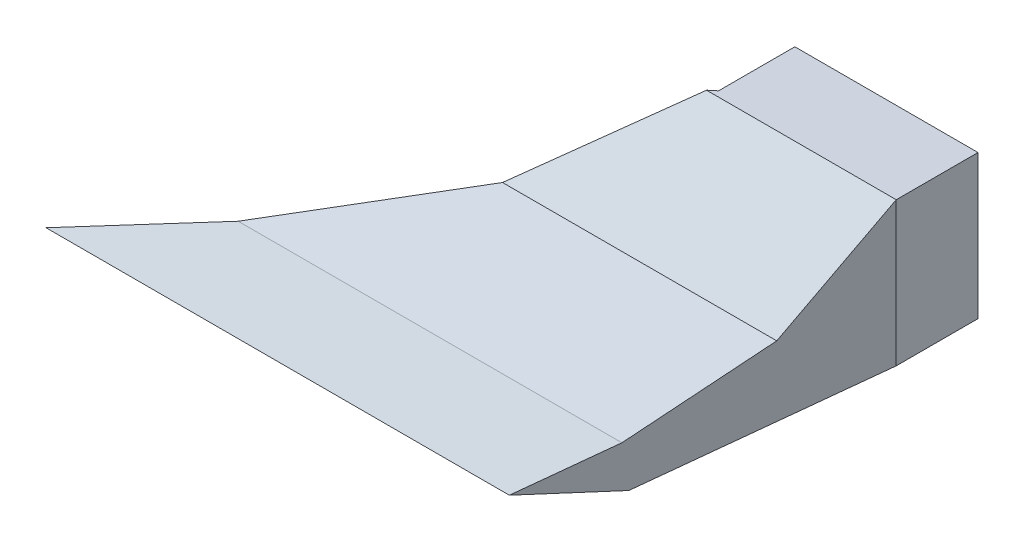
ISO-10303-21;
HEADER;
FILE_DESCRIPTION(('STEP AP214'),'2;1');
FILE_NAME('part.step','',(''),(''),'','','');
FILE_SCHEMA(('AUTOMOTIVE_DESIGN { 1 0 10303 214 1 1 1 1 }'));
ENDSEC;
DATA;
#1=APPLICATION_CONTEXT('core data for automotive mechanical design processes');
#2=APPLICATION_PROTOCOL_DEFINITION('international standard','automotive_design',2000,#1);
#3=PRODUCT_CONTEXT('',#1,'mechanical');
#4=PRODUCT('Part','Part','',(#3));
#5=PRODUCT_RELATED_PRODUCT_CATEGORY('part','',(#4));
#6=PRODUCT_DEFINITION_FORMATION('','',#4);
#7=PRODUCT_DEFINITION_CONTEXT('part definition',#1,'design');
#8=PRODUCT_DEFINITION('design','',#6,#7);
#9=PRODUCT_DEFINITION_SHAPE('','',#8);
#10=(LENGTH_UNIT() NAMED_UNIT(*) SI_UNIT(.MILLI.,.METRE.));
#11=(NAMED_UNIT(*) PLANE_ANGLE_UNIT() SI_UNIT($,.RADIAN.));
#12=(NAMED_UNIT(*) SI_UNIT($,.STERADIAN.) SOLID_ANGLE_UNIT());
#13=UNCERTAINTY_MEASURE_WITH_UNIT(LENGTH_MEASURE(1.E-05),#10,'distance_accuracy_value','');
#14=(GEOMETRIC_REPRESENTATION_CONTEXT(3) GLOBAL_UNCERTAINTY_ASSIGNED_CONTEXT((#13)) GLOBAL_UNIT_ASSIGNED_CONTEXT((#10,
#11,#12)) REPRESENTATION_CONTEXT('',''));
#15=CARTESIAN_POINT('',(0.,0.,0.));
#16=DIRECTION('',(0.,0.,1.));
#17=DIRECTION('',(1.,0.,0.));
#18=AXIS2_PLACEMENT_3D('',#15,#16,#17);
#19=CARTESIAN_POINT('',(500000.,-0.86013026819888,26.4289931192142));
#20=DIRECTION('',(0.,0.986393923832144,0.164398987305357));
#21=DIRECTION('',(0.,-0.164398987305357,0.986393923832144));
#22=AXIS2_PLACEMENT_3D('',#19,#20,#21);
#23=PLANE('',#22);
#24=DIRECTION('',(0.764927894758292,0.105892004627846,-0.635352027758269));
#25=VECTOR('',#24,1.);
#26=CARTESIAN_POINT('',(2.06072506725678,-0.860130268200976,26.4289931191972));
#27=LINE('',#26,#25);
#28=CARTESIAN_POINT('',(2.06072506713762,-0.860130268189644,26.4289931192439));
#29=VERTEX_POINT('',#28);
#30=CARTESIAN_POINT('',(10.5716005144245,0.318064001362778,19.3598275018221));
#31=VERTEX_POINT('',#30);
#32=EDGE_CURVE('E88',#29,#31,#27,.T.);
#33=ORIENTED_EDGE('',*,*,#32,.T.);
#34=DIRECTION('',(-1.,0.,0.));
#35=VECTOR('',#34,1.);
#36=CARTESIAN_POINT('',(500000.,0.318064001363084,19.3598275018424));
#37=LINE('',#36,#35);
#38=CARTESIAN_POINT('',(44.3455376396997,0.318064001362778,19.3598275018505));
#39=VERTEX_POINT('',#38);
#40=EDGE_CURVE('E303',#39,#31,#37,.T.);
#41=ORIENTED_EDGE('',*,*,#40,.F.);
#42=DIRECTION('',(-0.275900130811257,-0.158018055571948,0.948108333436423));
#43=VECTOR('',#42,1.);
#44=CARTESIAN_POINT('',(42.2884059283631,-0.860130268193871,26.4289931191819));
#45=LINE('',#44,#43);
#46=CARTESIAN_POINT('',(42.2884059283462,-0.860130268198152,26.4289931192197));
#47=VERTEX_POINT('',#46);
#48=EDGE_CURVE('E354',#39,#47,#45,.T.);
#49=ORIENTED_EDGE('',*,*,#48,.T.);
#50=DIRECTION('',(-1.,0.,0.));
#51=VECTOR('',#50,1.);
#52=CARTESIAN_POINT('',(500000.,-0.86013026819888,26.4289931192142));
#53=LINE('',#52,#51);
#54=EDGE_CURVE('E272',#47,#29,#53,.T.);
#55=ORIENTED_EDGE('',*,*,#54,.T.);
#56=EDGE_LOOP('',(#33,#41,#49,#55));
#57=FACE_BOUND('',#56,.T.);
#58=ADVANCED_FACE('F71',(#57),#23,.F.);
#59=CARTESIAN_POINT('',(500000.,0.318064001363084,19.3598275018424));
#60=DIRECTION('',(0.,0.934304423232793,0.356476148890271));
#61=DIRECTION('',(0.,-0.356476148890271,0.934304423232793));
#62=AXIS2_PLACEMENT_3D('',#59,#60,#61);
#63=PLANE('',#62);
#64=DIRECTION('',(0.747365230019963,0.236847542672983,-0.620764411421094));
#65=VECTOR('',#64,1.);
#66=CARTESIAN_POINT('',(10.5716005144795,0.318064001376683,19.3598275018292));
#67=LINE('',#66,#65);
#68=CARTESIAN_POINT('',(23.9862427421826,4.5692987656356,8.21757448764076));
#69=VERTEX_POINT('',#68);
#70=EDGE_CURVE('E326',#31,#69,#67,.T.);
#71=ORIENTED_EDGE('',*,*,#70,.T.);
#72=DIRECTION('',(-1.,0.,0.));
#73=VECTOR('',#72,1.);
#74=CARTESIAN_POINT('',(500000.,4.56929876564025,8.21757448763637));
#75=LINE('',#74,#73);
#76=CARTESIAN_POINT('',(47.5879403860766,4.56929876564271,8.21757448762655));
#77=VERTEX_POINT('',#76);
#78=EDGE_CURVE('E291',#77,#69,#75,.T.);
#79=ORIENTED_EDGE('',*,*,#78,.F.);
#80=DIRECTION('',(-0.262359194005471,-0.343988891431393,0.901576006719678));
#81=VECTOR('',#80,1.);
#82=CARTESIAN_POINT('',(44.3455376397561,0.318064001355367,19.3598275018512));
#83=LINE('',#82,#81);
#84=EDGE_CURVE('E352',#77,#39,#83,.T.);
#85=ORIENTED_EDGE('',*,*,#84,.T.);
#86=ORIENTED_EDGE('',*,*,#40,.T.);
#87=EDGE_LOOP('',(#71,#79,#85,#86));
#88=FACE_BOUND('',#87,.T.);
#89=ADVANCED_FACE('F430',(#88),#63,.F.);
#90=CARTESIAN_POINT('',(500000.,0.506896877524854,0.));
#91=DIRECTION('',(0.,-0.986393923832144,-0.164398987305357));
#92=DIRECTION('',(0.,0.164398987305357,-0.986393923832144));
#93=AXIS2_PLACEMENT_3D('',#90,#91,#92);
#94=PLANE('',#93);
#95=DIRECTION('',(-0.764927894758418,-0.105892004626313,0.635352027758373));
#96=VECTOR('',#95,1.);
#97=CARTESIAN_POINT('',(33.8797374949788,0.506896877521279,3.94086555448587E-11));
#98=LINE('',#97,#96);
#99=CARTESIAN_POINT('',(33.8797374950126,0.506896877524854,0.));
#100=VERTEX_POINT('',#99);
#101=CARTESIAN_POINT('',(11.0048124686273,-2.65976978914182,19.));
#102=VERTEX_POINT('',#101);
#103=EDGE_CURVE('E96',#100,#102,#98,.T.);
#104=ORIENTED_EDGE('',*,*,#103,.T.);
#105=DIRECTION('',(-1.,0.,0.));
#106=VECTOR('',#105,1.);
#107=CARTESIAN_POINT('',(500000.,-2.65976978914182,19.));
#108=LINE('',#107,#106);
#109=CARTESIAN_POINT('',(44.4502476727848,-2.65976978914182,19.));
#110=VERTEX_POINT('',#109);
#111=EDGE_CURVE('E279',#110,#102,#108,.T.);
#112=ORIENTED_EDGE('',*,*,#111,.F.);
#113=DIRECTION('',(0.275900130811211,0.158018055572984,-0.948108333436264));
#114=VECTOR('',#113,1.);
#115=CARTESIAN_POINT('',(49.9792598125001,0.506896877524854,0.));
#116=LINE('',#115,#114);
#117=CARTESIAN_POINT('',(49.9792598125091,0.506896877524854,-2.24935266191337E-12));
#118=VERTEX_POINT('',#117);
#119=EDGE_CURVE('E345',#110,#118,#116,.T.);
#120=ORIENTED_EDGE('',*,*,#119,.T.);
#121=DIRECTION('',(-1.,0.,0.));
#122=VECTOR('',#121,1.);
#123=CARTESIAN_POINT('',(500000.,0.506896877524854,0.));
#124=LINE('',#123,#122);
#125=CARTESIAN_POINT('',(34.2000000002258,0.506896877524854,0.));
#126=VERTEX_POINT('',#125);
#127=EDGE_CURVE('E267',#118,#126,#124,.T.);
#128=ORIENTED_EDGE('',*,*,#127,.T.);
#129=EDGE_CURVE('E271',#126,#100,#124,.T.);
#130=ORIENTED_EDGE('',*,*,#129,.T.);
#131=EDGE_LOOP('',(#104,#112,#120,#128,#130));
#132=FACE_BOUND('',#131,.T.);
#133=ADVANCED_FACE('F419',(#132),#94,.F.);
#134=CARTESIAN_POINT('',(500000.,-2.65976978914182,19.));
#135=DIRECTION('',(0.,0.,-1.));
#136=DIRECTION('',(-1.,0.,0.));
#137=AXIS2_PLACEMENT_3D('',#134,#135,#136);
#138=PLANE('',#137);
#139=DIRECTION('',(7.7712257540095E-11,-1.,-6.45503171446746E-11));
#140=VECTOR('',#139,1.);
#141=CARTESIAN_POINT('',(11.004812468483,-2.65976978914182,19.0000000000328));
#142=LINE('',#141,#140);
#143=CARTESIAN_POINT('',(11.0048124685224,-3.16666666666666,19.));
#144=VERTEX_POINT('',#143);
#145=EDGE_CURVE('E307',#102,#144,#142,.T.);
#146=ORIENTED_EDGE('',*,*,#145,.T.);
#147=DIRECTION('',(-1.,0.,0.));
#148=VECTOR('',#147,1.);
#149=CARTESIAN_POINT('',(0.5,-3.16666666666666,19.));
#150=LINE('',#149,#148);
#151=CARTESIAN_POINT('',(44.4502476726711,-3.16666666666666,19.));
#152=VERTEX_POINT('',#151);
#153=EDGE_CURVE('E445',#152,#144,#150,.T.);
#154=ORIENTED_EDGE('',*,*,#153,.F.);
#155=DIRECTION('',(1.7508186963851E-11,1.,-6.01698481623198E-11));
#156=VECTOR('',#155,1.);
#157=CARTESIAN_POINT('',(44.4502476727114,-2.65976978914182,18.9999999999671));
#158=LINE('',#157,#156);
#159=EDGE_CURVE('E310',#152,#110,#158,.T.);
#160=ORIENTED_EDGE('',*,*,#159,.T.);
#161=ORIENTED_EDGE('',*,*,#111,.T.);
#162=EDGE_LOOP('',(#146,#154,#160,#161));
#163=FACE_BOUND('',#162,.T.);
#164=ADVANCED_FACE('F306',(#163),#138,.F.);
#165=CARTESIAN_POINT('',(500000.,12.5049182044917,0.));
#166=DIRECTION('',(0.,0.719339800338652,0.694658370458996));
#167=DIRECTION('',(0.,-0.694658370458996,0.719339800338652));
#168=AXIS2_PLACEMENT_3D('',#165,#166,#167);
#169=PLANE('',#168);
#170=DIRECTION('',(0.654661885309191,0.525107427934069,-0.543764659620209));
#171=VECTOR('',#170,1.);
#172=CARTESIAN_POINT('',(23.9862427422175,4.56929876565937,8.21757448759148));
#173=LINE('',#172,#171);
#174=CARTESIAN_POINT('',(33.8797374950126,12.5049182044917,0.));
#175=VERTEX_POINT('',#174);
#176=EDGE_CURVE('E423',#69,#175,#173,.T.);
#177=ORIENTED_EDGE('',*,*,#176,.T.);
#178=DIRECTION('',(-1.,0.,0.));
#179=VECTOR('',#178,1.);
#180=CARTESIAN_POINT('',(500000.,12.5049182044917,0.));
#181=LINE('',#180,#179);
#182=CARTESIAN_POINT('',(34.2,12.5049182044917,0.));
#183=VERTEX_POINT('',#182);
#184=EDGE_CURVE('E288',#183,#175,#181,.T.);
#185=ORIENTED_EDGE('',*,*,#184,.F.);
#186=DIRECTION('',(0.,0.694658370458996,-0.719339800338652));
#187=VECTOR('',#186,1.);
#188=CARTESIAN_POINT('',(34.2,2.92427849419984,9.92104284551291));
#189=LINE('',#188,#187);
#190=CARTESIAN_POINT('',(34.2,12.7,-0.202013112917574));
#191=VERTEX_POINT('',#190);
#192=EDGE_CURVE('E260',#183,#191,#189,.T.);
#193=ORIENTED_EDGE('',*,*,#192,.T.);
#194=DIRECTION('',(1.,0.,0.));
#195=VECTOR('',#194,1.);
#196=CARTESIAN_POINT('',(50.,12.7,-0.202013112917572));
#197=LINE('',#196,#195);
#198=CARTESIAN_POINT('',(50.,12.7,-0.202013112917572));
#199=VERTEX_POINT('',#198);
#200=EDGE_CURVE('E380',#191,#199,#197,.T.);
#201=ORIENTED_EDGE('',*,*,#200,.T.);
#202=DIRECTION('',(0.,-0.694658370458996,0.719339800338652));
#203=VECTOR('',#202,1.);
#204=CARTESIAN_POINT('',(50.0000000000114,12.5049182044917,0.));
#205=LINE('',#204,#203);
#206=CARTESIAN_POINT('',(50.0000000001251,12.5049182044917,0.));
#207=VERTEX_POINT('',#206);
#208=EDGE_CURVE('E297',#199,#207,#205,.T.);
#209=ORIENTED_EDGE('',*,*,#208,.T.);
#210=DIRECTION('',(1.,0.,0.));
#211=VECTOR('',#210,1.);
#212=CARTESIAN_POINT('',(49.9792598125001,12.5049182044917,0.));
#213=LINE('',#212,#211);
#214=CARTESIAN_POINT('',(49.9792598125097,12.5049182044705,1.4210854715202E-11));
#215=VERTEX_POINT('',#214);
#216=EDGE_CURVE('E360',#215,#207,#213,.T.);
#217=ORIENTED_EDGE('',*,*,#216,.F.);
#218=DIRECTION('',(-0.20488754937742,-0.679921553623917,0.704079379777419));
#219=VECTOR('',#218,1.);
#220=CARTESIAN_POINT('',(47.5879403860838,4.56929876563095,8.21757448764918));
#221=LINE('',#220,#219);
#222=EDGE_CURVE('E350',#215,#77,#221,.T.);
#223=ORIENTED_EDGE('',*,*,#222,.T.);
#224=ORIENTED_EDGE('',*,*,#78,.T.);
#225=EDGE_LOOP('',(#177,#185,#193,#201,#209,#217,#223,#224));
#226=FACE_BOUND('',#225,.T.);
#227=ADVANCED_FACE('F426',(#226),#169,.F.);
#228=CARTESIAN_POINT('',(0.,0.,0.));
#229=DIRECTION('',(0.,0.,1.));
#230=DIRECTION('',(1.,0.,0.));
#231=AXIS2_PLACEMENT_3D('',#228,#229,#230);
#232=PLANE('',#231);
#233=ORIENTED_EDGE('',*,*,#184,.T.);
#234=DIRECTION('',(-3.25950462802655E-12,-1.,2.70719325120516E-12));
#235=VECTOR('',#234,1.);
#236=CARTESIAN_POINT('',(33.8797374950179,12.5049182044917,6.927693180669E-12));
#237=LINE('',#236,#235);
#238=EDGE_CURVE('E321',#175,#100,#237,.T.);
#239=ORIENTED_EDGE('',*,*,#238,.T.);
#240=ORIENTED_EDGE('',*,*,#129,.F.);
#241=DIRECTION('',(0.,1.,0.));
#242=VECTOR('',#241,1.);
#243=CARTESIAN_POINT('',(34.2,0.506896877524855,0.));
#244=LINE('',#243,#242);
#245=EDGE_CURVE('E247',#126,#183,#244,.T.);
#246=ORIENTED_EDGE('',*,*,#245,.T.);
#247=EDGE_LOOP('',(#233,#239,#240,#246));
#248=FACE_BOUND('',#247,.T.);
#249=ADVANCED_FACE('F421',(#248),#232,.T.);
#250=CARTESIAN_POINT('',(0.5,13.2,0.));
#251=DIRECTION('',(0.,0.719339800338653,0.694658370458996));
#252=DIRECTION('',(0.,-0.694658370458996,0.719339800338653));
#253=AXIS2_PLACEMENT_3D('',#250,#251,#252);
#254=PLANE('',#253);
#255=DIRECTION('',(-1.,0.,0.));
#256=VECTOR('',#255,1.);
#257=CARTESIAN_POINT('',(0.5,13.2,0.));
#258=LINE('',#257,#256);
#259=CARTESIAN_POINT('',(50.5,13.2,0.));
#260=VERTEX_POINT('',#259);
#261=CARTESIAN_POINT('',(33.0980282887762,13.2,0.));
#262=VERTEX_POINT('',#261);
#263=EDGE_CURVE('E12',#260,#262,#258,.T.);
#264=ORIENTED_EDGE('',*,*,#263,.T.);
#265=DIRECTION('',(-0.654661885309895,-0.525107427932587,0.543764659620793));
#266=VECTOR('',#265,1.);
#267=CARTESIAN_POINT('',(19.1270941281522,1.99384691927181,11.6043112160717));
#268=LINE('',#267,#266);
#269=CARTESIAN_POINT('',(22.8749250265038,5.,8.4913485730827));
#270=VERTEX_POINT('',#269);
#271=EDGE_CURVE('E342',#262,#270,#268,.T.);
#272=ORIENTED_EDGE('',*,*,#271,.T.);
#273=DIRECTION('',(-1.,0.,0.));
#274=VECTOR('',#273,1.);
#275=CARTESIAN_POINT('',(0.5,5.,8.4913485730827));
#276=LINE('',#275,#274);
#277=CARTESIAN_POINT('',(48.0290121397983,5.,8.4913485730827));
#278=VERTEX_POINT('',#277);
#279=EDGE_CURVE('E80',#278,#270,#276,.T.);
#280=ORIENTED_EDGE('',*,*,#279,.F.);
#281=DIRECTION('',(-0.204887549377384,-0.679921553624057,0.704079379777294));
#282=VECTOR('',#281,1.);
#283=CARTESIAN_POINT('',(48.4010546055065,6.23462695545517,7.21285493448591));
#284=LINE('',#283,#282);
#285=EDGE_CURVE('E371',#260,#278,#284,.T.);
#286=ORIENTED_EDGE('',*,*,#285,.F.);
#287=EDGE_LOOP('',(#264,#272,#280,#286));
#288=FACE_BOUND('',#287,.T.);
#289=ADVANCED_FACE('F464',(#288),#254,.T.);
#290=CARTESIAN_POINT('',(0.5,5.,8.4913485730827));
#291=DIRECTION('',(0.,0.934304423232793,0.356476148890271));
#292=DIRECTION('',(0.,-0.356476148890271,0.934304423232793));
#293=AXIS2_PLACEMENT_3D('',#290,#291,#292);
#294=PLANE('',#293);
#295=ORIENTED_EDGE('',*,*,#279,.T.);
#296=DIRECTION('',(-0.747365230019898,-0.236847542673329,0.620764411421041));
#297=VECTOR('',#296,1.);
#298=CARTESIAN_POINT('',(10.3773035432287,1.03937831373786,18.871920658329));
#299=LINE('',#298,#297);
#300=CARTESIAN_POINT('',(9.63154737958055,0.803040700347889,19.4913485730827));
#301=VERTEX_POINT('',#300);
#302=EDGE_CURVE('E339',#270,#301,#299,.T.);
#303=ORIENTED_EDGE('',*,*,#302,.T.);
#304=DIRECTION('',(-1.,0.,0.));
#305=VECTOR('',#304,1.);
#306=CARTESIAN_POINT('',(0.5,0.803040700347889,19.4913485730827));
#307=LINE('',#306,#305);
#308=CARTESIAN_POINT('',(44.8280051114941,0.803040700347889,19.4913485730827));
#309=VERTEX_POINT('',#308);
#310=EDGE_CURVE('E437',#309,#301,#307,.T.);
#311=ORIENTED_EDGE('',*,*,#310,.F.);
#312=DIRECTION('',(-0.26235919400547,-0.343988891431398,0.901576006719677));
#313=VECTOR('',#312,1.);
#314=CARTESIAN_POINT('',(44.7574786988718,0.710570899216938,19.7337068472086));
#315=LINE('',#314,#313);
#316=EDGE_CURVE('E369',#278,#309,#315,.T.);
#317=ORIENTED_EDGE('',*,*,#316,.F.);
#318=EDGE_LOOP('',(#295,#303,#311,#317));
#319=FACE_BOUND('',#318,.T.);
#320=ADVANCED_FACE('F461',(#319),#294,.T.);
#321=CARTESIAN_POINT('',(0.5,0.803040700347889,19.4913485730827));
#322=DIRECTION('',(0.,0.986393923832144,0.164398987305357));
#323=DIRECTION('',(0.,-0.164398987305357,0.986393923832144));
#324=AXIS2_PLACEMENT_3D('',#321,#322,#323);
#325=PLANE('',#324);
#326=ORIENTED_EDGE('',*,*,#310,.T.);
#327=DIRECTION('',(-0.764927894758411,-0.105892004626395,0.635352027758367));
#328=VECTOR('',#327,1.);
#329=CARTESIAN_POINT('',(4.28854491850682,0.0633876621938166,23.9292668020071));
#330=LINE('',#329,#328);
#331=CARTESIAN_POINT('',(0.,-0.530292632985445,27.4913485730827));
#332=VERTEX_POINT('',#331);
#333=EDGE_CURVE('E336',#301,#332,#330,.T.);
#334=ORIENTED_EDGE('',*,*,#333,.T.);
#335=DIRECTION('',(-1.,0.,0.));
#336=VECTOR('',#335,1.);
#337=CARTESIAN_POINT('',(0.5,-0.530292632985446,27.4913485730827));
#338=LINE('',#337,#336);
#339=CARTESIAN_POINT('',(42.5,-0.530292632985442,27.4913485730827));
#340=VERTEX_POINT('',#339);
#341=EDGE_CURVE('E440',#340,#332,#338,.T.);
#342=ORIENTED_EDGE('',*,*,#341,.F.);
#343=DIRECTION('',(-0.275900130811223,-0.158018055572718,0.948108333436305));
#344=VECTOR('',#343,1.);
#345=CARTESIAN_POINT('',(41.4537182570544,-1.12953630175566,31.0868105857039));
#346=LINE('',#345,#344);
#347=EDGE_CURVE('E367',#309,#340,#346,.T.);
#348=ORIENTED_EDGE('',*,*,#347,.F.);
#349=EDGE_LOOP('',(#326,#334,#342,#348));
#350=FACE_BOUND('',#349,.T.);
#351=ADVANCED_FACE('F456',(#350),#325,.T.);
#352=CARTESIAN_POINT('',(0.5,-0.530292632985446,27.4913485730827));
#353=DIRECTION('',(0.,-0.955028218655434,0.296514926389597));
#354=DIRECTION('',(0.,-0.296514926389597,-0.955028218655434));
#355=AXIS2_PLACEMENT_3D('',#352,#353,#354);
#356=PLANE('',#355);
#357=ORIENTED_EDGE('',*,*,#341,.T.);
#358=DIRECTION('',(0.754548991165686,-0.194586058304902,-0.626731270836398));
#359=VECTOR('',#358,1.);
#360=CARTESIAN_POINT('',(0.284672090034575,-0.603704989979883,27.2548988490119));
#361=LINE('',#360,#359);
#362=CARTESIAN_POINT('',(10.2231032622724,-3.16666666666667,19.));
#363=VERTEX_POINT('',#362);
#364=EDGE_CURVE('E334',#332,#363,#361,.T.);
#365=ORIENTED_EDGE('',*,*,#364,.T.);
#366=DIRECTION('',(-1.,0.,0.));
#367=VECTOR('',#366,1.);
#368=CARTESIAN_POINT('',(11.0048124685224,-3.16666666666667,19.0000000000001));
#369=LINE('',#368,#367);
#370=EDGE_CURVE('E328',#144,#363,#369,.T.);
#371=ORIENTED_EDGE('',*,*,#370,.F.);
#372=DIRECTION('',(-0.754548991165647,0.194586058305162,0.626731270836365));
#373=VECTOR('',#372,1.);
#374=CARTESIAN_POINT('',(11.0048124685224,-3.16666666666667,19.0000000000001));
#375=LINE('',#374,#373);
#376=EDGE_CURVE('E318',#144,#29,#375,.T.);
#377=ORIENTED_EDGE('',*,*,#376,.T.);
#378=ORIENTED_EDGE('',*,*,#54,.F.);
#379=DIRECTION('',(0.267765548515475,-0.285687417002261,-0.920154503762701));
#380=VECTOR('',#379,1.);
#381=CARTESIAN_POINT('',(44.4502476727025,-3.16666666666667,18.9999999999976));
#382=LINE('',#381,#380);
#383=EDGE_CURVE('E356',#47,#152,#382,.T.);
#384=ORIENTED_EDGE('',*,*,#383,.T.);
#385=CARTESIAN_POINT('',(44.9709878602024,-3.16666666666667,18.9999999999976));
#386=VERTEX_POINT('',#385);
#387=EDGE_CURVE('E443',#386,#152,#150,.T.);
#388=ORIENTED_EDGE('',*,*,#387,.F.);
#389=DIRECTION('',(0.26776554851561,-0.285687417000638,-0.920154503763166));
#390=VECTOR('',#389,1.);
#391=CARTESIAN_POINT('',(39.4886676631817,2.68259177953627,37.8395469406913));
#392=LINE('',#391,#390);
#393=EDGE_CURVE('E365',#340,#386,#392,.T.);
#394=ORIENTED_EDGE('',*,*,#393,.F.);
#395=EDGE_LOOP('',(#357,#365,#371,#377,#378,#384,#388,#394));
#396=FACE_BOUND('',#395,.T.);
#397=ADVANCED_FACE('F451',(#396),#356,.T.);
#398=CARTESIAN_POINT('',(0.5,-1.,6.));
#399=DIRECTION('',(0.,-0.986393923832144,-0.164398987305357));
#400=DIRECTION('',(0.,0.164398987305357,-0.986393923832144));
#401=AXIS2_PLACEMENT_3D('',#398,#399,#400);
#402=PLANE('',#401);
#403=ORIENTED_EDGE('',*,*,#153,.T.);
#404=ORIENTED_EDGE('',*,*,#370,.T.);
#405=DIRECTION('',(0.764927894758411,0.105892004626394,-0.635352027758367));
#406=VECTOR('',#405,1.);
#407=CARTESIAN_POINT('',(11.0274525794006,-3.05531739806995,18.3319043884197));
#408=LINE('',#407,#406);
#409=CARTESIAN_POINT('',(33.0980282887762,0.,0.));
#410=VERTEX_POINT('',#409);
#411=EDGE_CURVE('E243',#363,#410,#408,.T.);
#412=ORIENTED_EDGE('',*,*,#411,.T.);
#413=DIRECTION('',(-1.,0.,0.));
#414=VECTOR('',#413,1.);
#415=CARTESIAN_POINT('',(0.5,0.,0.));
#416=LINE('',#415,#414);
#417=CARTESIAN_POINT('',(50.5,0.,0.));
#418=VERTEX_POINT('',#417);
#419=EDGE_CURVE('E242',#418,#410,#416,.T.);
#420=ORIENTED_EDGE('',*,*,#419,.F.);
#421=DIRECTION('',(0.275900130811223,0.158018055572717,-0.948108333436305));
#422=VECTOR('',#421,1.);
#423=CARTESIAN_POINT('',(45.0808594094048,-3.10373922797074,18.6224353678245));
#424=LINE('',#423,#422);
#425=EDGE_CURVE('E362',#386,#418,#424,.T.);
#426=ORIENTED_EDGE('',*,*,#425,.F.);
#427=ORIENTED_EDGE('',*,*,#387,.T.);
#428=EDGE_LOOP('',(#403,#404,#412,#420,#426,#427));
#429=FACE_BOUND('',#428,.T.);
#430=ADVANCED_FACE('F73',(#429),#402,.T.);
#431=CARTESIAN_POINT('',(0.,13.2,-0.5));
#432=DIRECTION('',(0.,-1.,0.));
#433=DIRECTION('',(1.,0.,0.));
#434=AXIS2_PLACEMENT_3D('',#431,#432,#433);
#435=PLANE('',#434);
#436=DIRECTION('',(-0.769252914505123,0.,0.63894440566091));
#437=VECTOR('',#436,1.);
#438=CARTESIAN_POINT('',(33.7,13.2,-0.5));
#439=LINE('',#438,#437);
#440=CARTESIAN_POINT('',(33.7,13.2,-0.5));
#441=VERTEX_POINT('',#440);
#442=EDGE_CURVE('E225',#441,#262,#439,.T.);
#443=ORIENTED_EDGE('',*,*,#442,.T.);
#444=ORIENTED_EDGE('',*,*,#263,.F.);
#445=DIRECTION('',(0.,0.,1.));
#446=VECTOR('',#445,1.);
#447=CARTESIAN_POINT('',(50.5,13.2,-0.5));
#448=LINE('',#447,#446);
#449=CARTESIAN_POINT('',(50.5,13.2,-7.5));
#450=VERTEX_POINT('',#449);
#451=EDGE_CURVE('E277',#450,#260,#448,.T.);
#452=ORIENTED_EDGE('',*,*,#451,.F.);
#453=DIRECTION('',(1.,0.,0.));
#454=VECTOR('',#453,1.);
#455=CARTESIAN_POINT('',(50.5,13.2,-7.5));
#456=LINE('',#455,#454);
#457=CARTESIAN_POINT('',(33.7,13.2,-7.5));
#458=VERTEX_POINT('',#457);
#459=EDGE_CURVE('E253',#458,#450,#456,.T.);
#460=ORIENTED_EDGE('',*,*,#459,.F.);
#461=DIRECTION('',(0.,0.,1.));
#462=VECTOR('',#461,1.);
#463=CARTESIAN_POINT('',(33.7,13.2,-7.5));
#464=LINE('',#463,#462);
#465=EDGE_CURVE('E248',#458,#441,#464,.T.);
#466=ORIENTED_EDGE('',*,*,#465,.T.);
#467=EDGE_LOOP('',(#443,#444,#452,#460,#466));
#468=FACE_BOUND('',#467,.T.);
#469=ADVANCED_FACE('F468',(#468),#435,.F.);
#470=CARTESIAN_POINT('',(0.,0.,-0.5));
#471=DIRECTION('',(0.,1.,0.));
#472=DIRECTION('',(0.,0.,1.));
#473=AXIS2_PLACEMENT_3D('',#470,#471,#472);
#474=PLANE('',#473);
#475=DIRECTION('',(-0.769252914505123,0.,0.63894440566091));
#476=VECTOR('',#475,1.);
#477=CARTESIAN_POINT('',(13.7580234338051,0.,16.0638818190091));
#478=LINE('',#477,#476);
#479=CARTESIAN_POINT('',(33.7,0.,-0.500000000000003));
#480=VERTEX_POINT('',#479);
#481=EDGE_CURVE('E222',#480,#410,#478,.T.);
#482=ORIENTED_EDGE('',*,*,#481,.F.);
#483=DIRECTION('',(0.,0.,1.));
#484=VECTOR('',#483,1.);
#485=CARTESIAN_POINT('',(33.7,0.,-7.5));
#486=LINE('',#485,#484);
#487=CARTESIAN_POINT('',(33.7,0.,-7.5));
#488=VERTEX_POINT('',#487);
#489=EDGE_CURVE('E238',#488,#480,#486,.T.);
#490=ORIENTED_EDGE('',*,*,#489,.F.);
#491=DIRECTION('',(-1.,0.,0.));
#492=VECTOR('',#491,1.);
#493=CARTESIAN_POINT('',(50.5,0.,-7.5));
#494=LINE('',#493,#492);
#495=CARTESIAN_POINT('',(50.5,0.,-7.5));
#496=VERTEX_POINT('',#495);
#497=EDGE_CURVE('E396',#496,#488,#494,.T.);
#498=ORIENTED_EDGE('',*,*,#497,.F.);
#499=DIRECTION('',(0.,0.,1.));
#500=VECTOR('',#499,1.);
#501=CARTESIAN_POINT('',(50.5,0.,-0.5));
#502=LINE('',#501,#500);
#503=EDGE_CURVE('E413',#496,#418,#502,.T.);
#504=ORIENTED_EDGE('',*,*,#503,.T.);
#505=ORIENTED_EDGE('',*,*,#419,.T.);
#506=EDGE_LOOP('',(#482,#490,#498,#504,#505));
#507=FACE_BOUND('',#506,.T.);
#508=ADVANCED_FACE('F236',(#507),#474,.F.);
#509=CARTESIAN_POINT('',(50.,0.,0.));
#510=DIRECTION('',(-1.,0.,0.));
#511=DIRECTION('',(0.,0.,1.));
#512=AXIS2_PLACEMENT_3D('',#509,#510,#511);
#513=PLANE('',#512);
#514=DIRECTION('',(0.,-1.,0.));
#515=VECTOR('',#514,1.);
#516=CARTESIAN_POINT('',(50.,0.,0.));
#517=LINE('',#516,#515);
#518=CARTESIAN_POINT('',(50.,0.506896877524855,0.));
#519=VERTEX_POINT('',#518);
#520=EDGE_CURVE('E375',#207,#519,#517,.T.);
#521=ORIENTED_EDGE('',*,*,#520,.F.);
#522=ORIENTED_EDGE('',*,*,#208,.F.);
#523=DIRECTION('',(0.,0.,-1.));
#524=VECTOR('',#523,1.);
#525=CARTESIAN_POINT('',(50.,12.7,19.1729590692126));
#526=LINE('',#525,#524);
#527=CARTESIAN_POINT('',(50.,12.7,-7.5));
#528=VERTEX_POINT('',#527);
#529=EDGE_CURVE('E382',#199,#528,#526,.T.);
#530=ORIENTED_EDGE('',*,*,#529,.T.);
#531=DIRECTION('',(0.,-1.,0.));
#532=VECTOR('',#531,1.);
#533=CARTESIAN_POINT('',(50.,12.5049182044917,-7.5));
#534=LINE('',#533,#532);
#535=CARTESIAN_POINT('',(50.,0.506896877524855,-7.5));
#536=VERTEX_POINT('',#535);
#537=EDGE_CURVE('E389',#528,#536,#534,.T.);
#538=ORIENTED_EDGE('',*,*,#537,.T.);
#539=DIRECTION('',(0.,0.,1.));
#540=VECTOR('',#539,1.);
#541=CARTESIAN_POINT('',(50.,0.506896877524855,-0.5));
#542=LINE('',#541,#540);
#543=EDGE_CURVE('E403',#536,#519,#542,.T.);
#544=ORIENTED_EDGE('',*,*,#543,.T.);
#545=EDGE_LOOP('',(#521,#522,#530,#538,#544));
#546=FACE_BOUND('',#545,.T.);
#547=ADVANCED_FACE('F483',(#546),#513,.T.);
#548=CARTESIAN_POINT('',(50.5,0.,0.));
#549=DIRECTION('',(-1.,0.,0.));
#550=DIRECTION('',(0.,0.,1.));
#551=AXIS2_PLACEMENT_3D('',#548,#549,#550);
#552=PLANE('',#551);
#553=ORIENTED_EDGE('',*,*,#451,.T.);
#554=DIRECTION('',(0.,1.,0.));
#555=VECTOR('',#554,1.);
#556=CARTESIAN_POINT('',(50.5,0.506896877524854,0.));
#557=LINE('',#556,#555);
#558=EDGE_CURVE('E373',#418,#260,#557,.T.);
#559=ORIENTED_EDGE('',*,*,#558,.F.);
#560=ORIENTED_EDGE('',*,*,#503,.F.);
#561=DIRECTION('',(0.,-1.,0.));
#562=VECTOR('',#561,1.);
#563=CARTESIAN_POINT('',(50.5,13.2,-7.5));
#564=LINE('',#563,#562);
#565=EDGE_CURVE('E230',#450,#496,#564,.T.);
#566=ORIENTED_EDGE('',*,*,#565,.F.);
#567=EDGE_LOOP('',(#553,#559,#560,#566));
#568=FACE_BOUND('',#567,.T.);
#569=ADVANCED_FACE('F472',(#568),#552,.F.);
#570=CARTESIAN_POINT('',(50.,0.506896877524855,-0.5));
#571=DIRECTION('',(0.,1.,0.));
#572=DIRECTION('',(0.,0.,1.));
#573=AXIS2_PLACEMENT_3D('',#570,#571,#572);
#574=PLANE('',#573);
#575=EDGE_CURVE('E270',#519,#118,#124,.T.);
#576=ORIENTED_EDGE('',*,*,#575,.F.);
#577=ORIENTED_EDGE('',*,*,#543,.F.);
#578=DIRECTION('',(-1.,0.,0.));
#579=VECTOR('',#578,1.);
#580=CARTESIAN_POINT('',(34.2,0.506896877524857,-7.5));
#581=LINE('',#580,#579);
#582=CARTESIAN_POINT('',(34.2,0.506896877524857,-7.5));
#583=VERTEX_POINT('',#582);
#584=EDGE_CURVE('E231',#536,#583,#581,.T.);
#585=ORIENTED_EDGE('',*,*,#584,.T.);
#586=DIRECTION('',(0.,0.,1.));
#587=VECTOR('',#586,1.);
#588=CARTESIAN_POINT('',(34.2,0.506896877524855,-0.5));
#589=LINE('',#588,#587);
#590=EDGE_CURVE('E251',#583,#126,#589,.T.);
#591=ORIENTED_EDGE('',*,*,#590,.T.);
#592=ORIENTED_EDGE('',*,*,#127,.F.);
#593=EDGE_LOOP('',(#576,#577,#585,#591,#592));
#594=FACE_BOUND('',#593,.T.);
#595=ADVANCED_FACE('F480',(#594),#574,.T.);
#596=CARTESIAN_POINT('',(34.2,0.506896877524855,-0.5));
#597=DIRECTION('',(1.,0.,0.));
#598=DIRECTION('',(0.,0.,-1.));
#599=AXIS2_PLACEMENT_3D('',#596,#597,#598);
#600=PLANE('',#599);
#601=ORIENTED_EDGE('',*,*,#245,.F.);
#602=ORIENTED_EDGE('',*,*,#590,.F.);
#603=DIRECTION('',(0.,1.,0.));
#604=VECTOR('',#603,1.);
#605=CARTESIAN_POINT('',(34.2,12.5049182044917,-7.5));
#606=LINE('',#605,#604);
#607=CARTESIAN_POINT('',(34.2,12.7,-7.5));
#608=VERTEX_POINT('',#607);
#609=EDGE_CURVE('E385',#583,#608,#606,.T.);
#610=ORIENTED_EDGE('',*,*,#609,.T.);
#611=DIRECTION('',(0.,0.,-1.));
#612=VECTOR('',#611,1.);
#613=CARTESIAN_POINT('',(34.2,12.7,19.1729590692126));
#614=LINE('',#613,#612);
#615=EDGE_CURVE('E263',#191,#608,#614,.T.);
#616=ORIENTED_EDGE('',*,*,#615,.F.);
#617=ORIENTED_EDGE('',*,*,#192,.F.);
#618=EDGE_LOOP('',(#601,#602,#610,#616,#617));
#619=FACE_BOUND('',#618,.T.);
#620=ADVANCED_FACE('F490',(#619),#600,.T.);
#621=CARTESIAN_POINT('',(0.,0.,-7.5));
#622=DIRECTION('',(0.,0.,-1.));
#623=DIRECTION('',(-1.,0.,0.));
#624=AXIS2_PLACEMENT_3D('',#621,#622,#623);
#625=PLANE('',#624);
#626=DIRECTION('',(1.,0.,0.));
#627=VECTOR('',#626,1.);
#628=CARTESIAN_POINT('',(50.,12.7,-7.5));
#629=LINE('',#628,#627);
#630=EDGE_CURVE('E264',#608,#528,#629,.T.);
#631=ORIENTED_EDGE('',*,*,#630,.F.);
#632=ORIENTED_EDGE('',*,*,#609,.F.);
#633=ORIENTED_EDGE('',*,*,#584,.F.);
#634=ORIENTED_EDGE('',*,*,#537,.F.);
#635=EDGE_LOOP('',(#631,#632,#633,#634));
#636=FACE_BOUND('',#635,.T.);
#637=ORIENTED_EDGE('',*,*,#565,.T.);
#638=ORIENTED_EDGE('',*,*,#497,.T.);
#639=DIRECTION('',(0.,1.,0.));
#640=VECTOR('',#639,1.);
#641=CARTESIAN_POINT('',(33.7,13.2,-7.5));
#642=LINE('',#641,#640);
#643=EDGE_CURVE('E246',#488,#458,#642,.T.);
#644=ORIENTED_EDGE('',*,*,#643,.T.);
#645=ORIENTED_EDGE('',*,*,#459,.T.);
#646=EDGE_LOOP('',(#637,#638,#644,#645));
#647=FACE_BOUND('',#646,.T.);
#648=ADVANCED_FACE('F471',(#636,#647),#625,.T.);
#649=CARTESIAN_POINT('',(33.7,13.2,-7.5));
#650=DIRECTION('',(1.,0.,0.));
#651=DIRECTION('',(0.,0.,-1.));
#652=AXIS2_PLACEMENT_3D('',#649,#650,#651);
#653=PLANE('',#652);
#654=DIRECTION('',(0.,1.,0.));
#655=VECTOR('',#654,1.);
#656=CARTESIAN_POINT('',(33.7,13.2,-0.5));
#657=LINE('',#656,#655);
#658=EDGE_CURVE('E218',#480,#441,#657,.T.);
#659=ORIENTED_EDGE('',*,*,#658,.T.);
#660=ORIENTED_EDGE('',*,*,#465,.F.);
#661=ORIENTED_EDGE('',*,*,#643,.F.);
#662=ORIENTED_EDGE('',*,*,#489,.T.);
#663=EDGE_LOOP('',(#659,#660,#661,#662));
#664=FACE_BOUND('',#663,.T.);
#665=ADVANCED_FACE('F245',(#664),#653,.F.);
#666=CARTESIAN_POINT('',(50.,12.7,19.1729590692126));
#667=DIRECTION('',(0.,1.,0.));
#668=DIRECTION('',(0.,0.,1.));
#669=AXIS2_PLACEMENT_3D('',#666,#667,#668);
#670=PLANE('',#669);
#671=ORIENTED_EDGE('',*,*,#615,.T.);
#672=ORIENTED_EDGE('',*,*,#630,.T.);
#673=ORIENTED_EDGE('',*,*,#529,.F.);
#674=ORIENTED_EDGE('',*,*,#200,.F.);
#675=EDGE_LOOP('',(#671,#672,#673,#674));
#676=FACE_BOUND('',#675,.T.);
#677=ADVANCED_FACE('F486',(#676),#670,.F.);
#678=CARTESIAN_POINT('',(46.557451164971,0.,13.5482480362731));
#679=DIRECTION('',(-0.960171716954331,0.,-0.279410583122708));
#680=DIRECTION('',(-0.279410583122708,0.,0.960171716954331));
#681=AXIS2_PLACEMENT_3D('',#678,#679,#680);
#682=PLANE('',#681);
#683=ORIENTED_EDGE('',*,*,#425,.T.);
#684=ORIENTED_EDGE('',*,*,#558,.T.);
#685=ORIENTED_EDGE('',*,*,#285,.T.);
#686=ORIENTED_EDGE('',*,*,#316,.T.);
#687=ORIENTED_EDGE('',*,*,#347,.T.);
#688=ORIENTED_EDGE('',*,*,#393,.T.);
#689=EDGE_LOOP('',(#683,#684,#685,#686,#687,#688));
#690=FACE_BOUND('',#689,.T.);
#691=ADVANCED_FACE('F474',(#690),#682,.F.);
#692=CARTESIAN_POINT('',(49.9792598125001,12.5049182044917,0.));
#693=DIRECTION('',(0.,0.,-1.));
#694=DIRECTION('',(0.,1.,0.));
#695=AXIS2_PLACEMENT_3D('',#692,#693,#694);
#696=PLANE('',#695);
#697=ORIENTED_EDGE('',*,*,#216,.T.);
#698=ORIENTED_EDGE('',*,*,#520,.T.);
#699=ORIENTED_EDGE('',*,*,#575,.T.);
#700=DIRECTION('',(0.,1.,0.));
#701=VECTOR('',#700,1.);
#702=CARTESIAN_POINT('',(49.9792598125001,12.5049182044917,0.));
#703=LINE('',#702,#701);
#704=EDGE_CURVE('E347',#118,#215,#703,.T.);
#705=ORIENTED_EDGE('',*,*,#704,.T.);
#706=EDGE_LOOP('',(#697,#698,#699,#705));
#707=FACE_BOUND('',#706,.T.);
#708=ADVANCED_FACE('F482',(#707),#696,.T.);
#709=CARTESIAN_POINT('',(46.036710977471,0.,13.5482480362732));
#710=DIRECTION('',(0.960171716954331,0.,0.279410583122708));
#711=DIRECTION('',(0.279410583122708,0.,-0.960171716954331));
#712=AXIS2_PLACEMENT_3D('',#709,#710,#711);
#713=PLANE('',#712);
#714=ORIENTED_EDGE('',*,*,#119,.F.);
#715=ORIENTED_EDGE('',*,*,#159,.F.);
#716=ORIENTED_EDGE('',*,*,#383,.F.);
#717=ORIENTED_EDGE('',*,*,#48,.F.);
#718=ORIENTED_EDGE('',*,*,#84,.F.);
#719=ORIENTED_EDGE('',*,*,#222,.F.);
#720=ORIENTED_EDGE('',*,*,#704,.F.);
#721=EDGE_LOOP('',(#714,#715,#716,#717,#718,#719,#720));
#722=FACE_BOUND('',#721,.T.);
#723=ADVANCED_FACE('F477',(#722),#713,.F.);
#724=CARTESIAN_POINT('',(13.5122685106744,0.,16.2680067957718));
#725=DIRECTION('',(-0.63894440566091,0.,-0.769252914505123));
#726=DIRECTION('',(-0.769252914505123,0.,0.63894440566091));
#727=AXIS2_PLACEMENT_3D('',#724,#725,#726);
#728=PLANE('',#727);
#729=ORIENTED_EDGE('',*,*,#411,.F.);
#730=ORIENTED_EDGE('',*,*,#364,.F.);
#731=ORIENTED_EDGE('',*,*,#333,.F.);
#732=ORIENTED_EDGE('',*,*,#302,.F.);
#733=ORIENTED_EDGE('',*,*,#271,.F.);
#734=ORIENTED_EDGE('',*,*,#442,.F.);
#735=ORIENTED_EDGE('',*,*,#658,.F.);
#736=ORIENTED_EDGE('',*,*,#481,.T.);
#737=EDGE_LOOP('',(#729,#730,#731,#732,#733,#734,#735,#736));
#738=FACE_BOUND('',#737,.T.);
#739=ADVANCED_FACE('F221',(#738),#728,.T.);
#740=CARTESIAN_POINT('',(14.2939777169244,0.,16.2680067957718));
#741=DIRECTION('',(-0.638944405660911,0.,-0.769252914505123));
#742=DIRECTION('',(-0.769252914505123,0.,0.638944405660911));
#743=AXIS2_PLACEMENT_3D('',#740,#741,#742);
#744=PLANE('',#743);
#745=ORIENTED_EDGE('',*,*,#176,.F.);
#746=ORIENTED_EDGE('',*,*,#70,.F.);
#747=ORIENTED_EDGE('',*,*,#32,.F.);
#748=ORIENTED_EDGE('',*,*,#376,.F.);
#749=ORIENTED_EDGE('',*,*,#145,.F.);
#750=ORIENTED_EDGE('',*,*,#103,.F.);
#751=ORIENTED_EDGE('',*,*,#238,.F.);
#752=EDGE_LOOP('',(#745,#746,#747,#748,#749,#750,#751));
#753=FACE_BOUND('',#752,.T.);
#754=ADVANCED_FACE('F315',(#753),#744,.F.);
#755=CLOSED_SHELL('',(#58,#89,#133,#164,#227,#249,#289,#320,#351,#397,#430,#469,#508,#547,#569,
#595,#620,#648,#665,#677,#691,#708,#723,#739,#754));
#756=MANIFOLD_SOLID_BREP('B2',#755);
#757=ADVANCED_BREP_SHAPE_REPRESENTATION('',(#18,#756),#14);
#758=SHAPE_DEFINITION_REPRESENTATION(#9,#757);
ENDSEC;
END-ISO-10303-21;
